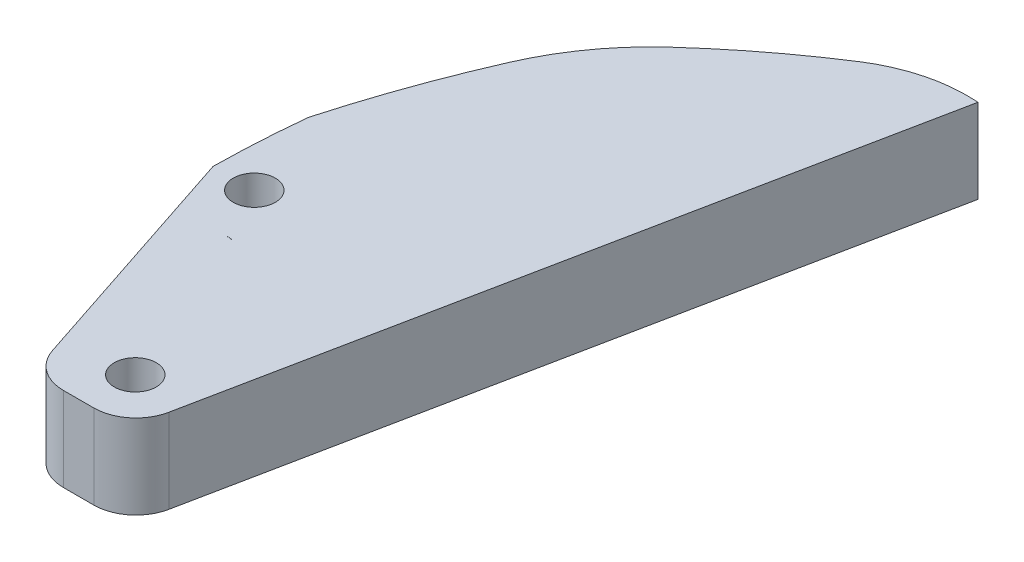
ISO-10303-21;
HEADER;
FILE_DESCRIPTION(('STEP AP214'),'2;1');
FILE_NAME('part.step','',(''),(''),'','','');
FILE_SCHEMA(('AUTOMOTIVE_DESIGN { 1 0 10303 214 1 1 1 1 }'));
ENDSEC;
DATA;
#1=APPLICATION_CONTEXT('core data for automotive mechanical design processes');
#2=APPLICATION_PROTOCOL_DEFINITION('international standard','automotive_design',2000,#1);
#3=PRODUCT_CONTEXT('',#1,'mechanical');
#4=PRODUCT('Part','Part','',(#3));
#5=PRODUCT_RELATED_PRODUCT_CATEGORY('part','',(#4));
#6=PRODUCT_DEFINITION_FORMATION('','',#4);
#7=PRODUCT_DEFINITION_CONTEXT('part definition',#1,'design');
#8=PRODUCT_DEFINITION('design','',#6,#7);
#9=PRODUCT_DEFINITION_SHAPE('','',#8);
#10=(LENGTH_UNIT() NAMED_UNIT(*) SI_UNIT(.MILLI.,.METRE.));
#11=(NAMED_UNIT(*) PLANE_ANGLE_UNIT() SI_UNIT($,.RADIAN.));
#12=(NAMED_UNIT(*) SI_UNIT($,.STERADIAN.) SOLID_ANGLE_UNIT());
#13=UNCERTAINTY_MEASURE_WITH_UNIT(LENGTH_MEASURE(1.E-05),#10,'distance_accuracy_value','');
#14=(GEOMETRIC_REPRESENTATION_CONTEXT(3) GLOBAL_UNCERTAINTY_ASSIGNED_CONTEXT((#13)) GLOBAL_UNIT_ASSIGNED_CONTEXT((#10,
#11,#12)) REPRESENTATION_CONTEXT('',''));
#15=CARTESIAN_POINT('',(0.,0.,0.));
#16=DIRECTION('',(0.,0.,1.));
#17=DIRECTION('',(1.,0.,0.));
#18=AXIS2_PLACEMENT_3D('',#15,#16,#17);
#19=CARTESIAN_POINT('',(9.61266494774314,4.,-27.3528767027445));
#20=DIRECTION('',(0.,1.,0.));
#21=DIRECTION('',(0.,0.,1.));
#22=AXIS2_PLACEMENT_3D('',#19,#20,#21);
#23=CYLINDRICAL_SURFACE('',#22,7.);
#24=DIRECTION('',(0.,-1.,0.));
#25=VECTOR('',#24,1.);
#26=CARTESIAN_POINT('',(7.32942538303462,4.,-33.9700375055473));
#27=LINE('',#26,#25);
#28=CARTESIAN_POINT('',(7.32942538303469,0.,-33.9700375055473));
#29=VERTEX_POINT('',#28);
#30=CARTESIAN_POINT('',(7.32942538303469,4.,-33.9700375055473));
#31=VERTEX_POINT('',#30);
#32=EDGE_CURVE('E256',#29,#31,#27,.F.);
#33=ORIENTED_EDGE('',*,*,#32,.F.);
#34=CARTESIAN_POINT('',(9.61266494774314,0.,-27.3528767027445));
#35=DIRECTION('',(0.,1.,0.));
#36=DIRECTION('',(0.,0.,1.));
#37=AXIS2_PLACEMENT_3D('',#34,#35,#36);
#38=CIRCLE('',#37,7.);
#39=CARTESIAN_POINT('',(5.84513074595936,0.,-33.25251110145));
#40=VERTEX_POINT('',#39);
#41=EDGE_CURVE('E42',#40,#29,#38,.F.);
#42=ORIENTED_EDGE('',*,*,#41,.F.);
#43=DIRECTION('',(0.,-1.,0.));
#44=VECTOR('',#43,1.);
#45=CARTESIAN_POINT('',(5.84513074595937,4.,-33.25251110145));
#46=LINE('',#45,#44);
#47=CARTESIAN_POINT('',(5.84513074595936,4.,-33.25251110145));
#48=VERTEX_POINT('',#47);
#49=EDGE_CURVE('E259',#48,#40,#46,.T.);
#50=ORIENTED_EDGE('',*,*,#49,.F.);
#51=CARTESIAN_POINT('',(9.61266494774314,4.,-27.3528767027445));
#52=DIRECTION('',(0.,1.,0.));
#53=DIRECTION('',(0.,0.,1.));
#54=AXIS2_PLACEMENT_3D('',#51,#52,#53);
#55=CIRCLE('',#54,7.);
#56=EDGE_CURVE('E11',#31,#48,#55,.T.);
#57=ORIENTED_EDGE('',*,*,#56,.F.);
#58=EDGE_LOOP('',(#33,#42,#50,#57));
#59=FACE_BOUND('',#58,.T.);
#60=ADVANCED_FACE('F35',(#59),#23,.T.);
#61=CARTESIAN_POINT('',(9.70663606833445,4.,-27.3848139031822));
#62=DIRECTION('',(0.,1.,0.));
#63=DIRECTION('',(0.,0.,1.));
#64=AXIS2_PLACEMENT_3D('',#61,#62,#63);
#65=CYLINDRICAL_SURFACE('',#64,7.);
#66=DIRECTION('',(0.,-1.,0.));
#67=VECTOR('',#66,1.);
#68=CARTESIAN_POINT('',(9.49857825519762,4.,-34.3817212161593));
#69=LINE('',#68,#67);
#70=CARTESIAN_POINT('',(9.49857825519765,0.,-34.3817212161593));
#71=VERTEX_POINT('',#70);
#72=CARTESIAN_POINT('',(9.49857825519765,4.,-34.3817212161593));
#73=VERTEX_POINT('',#72);
#74=EDGE_CURVE('E246',#71,#73,#69,.F.);
#75=ORIENTED_EDGE('',*,*,#74,.F.);
#76=CARTESIAN_POINT('',(9.70663606833445,0.,-27.3848139031822));
#77=DIRECTION('',(0.,1.,0.));
#78=DIRECTION('',(0.,0.,1.));
#79=AXIS2_PLACEMENT_3D('',#76,#77,#78);
#80=CIRCLE('',#79,7.);
#81=CARTESIAN_POINT('',(7.48492721860419,0.,-34.0228866496222));
#82=VERTEX_POINT('',#81);
#83=EDGE_CURVE('E252',#82,#71,#80,.F.);
#84=ORIENTED_EDGE('',*,*,#83,.F.);
#85=DIRECTION('',(0.,-1.,0.));
#86=VECTOR('',#85,1.);
#87=CARTESIAN_POINT('',(7.4849272186042,4.,-34.0228866496223));
#88=LINE('',#87,#86);
#89=CARTESIAN_POINT('',(7.48492721860419,4.,-34.0228866496222));
#90=VERTEX_POINT('',#89);
#91=EDGE_CURVE('E249',#90,#82,#88,.T.);
#92=ORIENTED_EDGE('',*,*,#91,.F.);
#93=CARTESIAN_POINT('',(9.70663606833445,4.,-27.3848139031822));
#94=DIRECTION('',(0.,1.,0.));
#95=DIRECTION('',(0.,0.,1.));
#96=AXIS2_PLACEMENT_3D('',#93,#94,#95);
#97=CIRCLE('',#96,7.);
#98=EDGE_CURVE('E254',#73,#90,#97,.T.);
#99=ORIENTED_EDGE('',*,*,#98,.F.);
#100=EDGE_LOOP('',(#75,#84,#92,#99));
#101=FACE_BOUND('',#100,.T.);
#102=ADVANCED_FACE('F270',(#101),#65,.T.);
#103=CARTESIAN_POINT('',(9.41889752565897,4.,-19.6788428566589));
#104=DIRECTION('',(0.,1.,0.));
#105=DIRECTION('',(0.,0.,1.));
#106=AXIS2_PLACEMENT_3D('',#103,#104,#105);
#107=CYLINDRICAL_SURFACE('',#106,13.);
#108=DIRECTION('',(0.,-1.,0.));
#109=VECTOR('',#108,1.);
#110=CARTESIAN_POINT('',(0.680013637686255,4.,-29.3033900352294));
#111=LINE('',#110,#109);
#112=CARTESIAN_POINT('',(0.680013637686262,0.,-29.3033900352294));
#113=VERTEX_POINT('',#112);
#114=CARTESIAN_POINT('',(0.680013637686262,4.,-29.3033900352294));
#115=VERTEX_POINT('',#114);
#116=EDGE_CURVE('E234',#113,#115,#111,.F.);
#117=ORIENTED_EDGE('',*,*,#116,.F.);
#118=CARTESIAN_POINT('',(9.41889752565897,0.,-19.6788428566589));
#119=DIRECTION('',(0.,1.,0.));
#120=DIRECTION('',(0.,0.,1.));
#121=AXIS2_PLACEMENT_3D('',#118,#119,#120);
#122=CIRCLE('',#121,13.);
#123=CARTESIAN_POINT('',(-2.4861675872471,0.,-24.9008563244188));
#124=VERTEX_POINT('',#123);
#125=EDGE_CURVE('E241',#124,#113,#122,.F.);
#126=ORIENTED_EDGE('',*,*,#125,.F.);
#127=DIRECTION('',(0.,-1.,0.));
#128=VECTOR('',#127,1.);
#129=CARTESIAN_POINT('',(-2.4861675872471,4.,-24.9008563244188));
#130=LINE('',#129,#128);
#131=CARTESIAN_POINT('',(-2.4861675872471,4.,-24.9008563244188));
#132=VERTEX_POINT('',#131);
#133=EDGE_CURVE('E238',#132,#124,#130,.T.);
#134=ORIENTED_EDGE('',*,*,#133,.F.);
#135=CARTESIAN_POINT('',(9.41889752565897,4.,-19.6788428566589));
#136=DIRECTION('',(0.,1.,0.));
#137=DIRECTION('',(0.,0.,1.));
#138=AXIS2_PLACEMENT_3D('',#135,#136,#137);
#139=CIRCLE('',#138,13.);
#140=EDGE_CURVE('E244',#115,#132,#139,.T.);
#141=ORIENTED_EDGE('',*,*,#140,.F.);
#142=EDGE_LOOP('',(#117,#126,#134,#141));
#143=FACE_BOUND('',#142,.T.);
#144=ADVANCED_FACE('F314',(#143),#107,.T.);
#145=CARTESIAN_POINT('',(45.9804828344079,4.,-3.64154368406012));
#146=DIRECTION('',(0.,-1.,0.));
#147=DIRECTION('',(0.,0.,-1.));
#148=AXIS2_PLACEMENT_3D('',#145,#146,#147);
#149=CYLINDRICAL_SURFACE('',#148,52.9242343075025);
#150=CARTESIAN_POINT('',(45.9804828344079,4.,-3.64154368406012));
#151=DIRECTION('',(0.,1.,0.));
#152=DIRECTION('',(0.,0.,1.));
#153=AXIS2_PLACEMENT_3D('',#150,#151,#152);
#154=CIRCLE('',#153,52.9242343075025);
#155=CARTESIAN_POINT('',(-5.00389485258667,4.,-17.8390015165496));
#156=VERTEX_POINT('',#155);
#157=EDGE_CURVE('E158',#132,#156,#154,.T.);
#158=ORIENTED_EDGE('',*,*,#157,.F.);
#159=ORIENTED_EDGE('',*,*,#133,.T.);
#160=CARTESIAN_POINT('',(45.9804828344079,0.,-3.64154368406012));
#161=DIRECTION('',(0.,1.,0.));
#162=DIRECTION('',(0.,0.,1.));
#163=AXIS2_PLACEMENT_3D('',#160,#161,#162);
#164=CIRCLE('',#163,52.9242343075025);
#165=CARTESIAN_POINT('',(-5.00389485258667,0.,-17.8390015165496));
#166=VERTEX_POINT('',#165);
#167=EDGE_CURVE('E191',#124,#166,#164,.T.);
#168=ORIENTED_EDGE('',*,*,#167,.T.);
#169=DIRECTION('',(0.,-1.,0.));
#170=VECTOR('',#169,1.);
#171=CARTESIAN_POINT('',(-5.00389485258667,4.,-17.8390015165496));
#172=LINE('',#171,#170);
#173=EDGE_CURVE('E231',#156,#166,#172,.T.);
#174=ORIENTED_EDGE('',*,*,#173,.F.);
#175=EDGE_LOOP('',(#158,#159,#168,#174));
#176=FACE_BOUND('',#175,.T.);
#177=ADVANCED_FACE('F309',(#176),#149,.T.);
#178=CARTESIAN_POINT('',(40.4186006337047,4.,-13.033633897636));
#179=DIRECTION('',(0.,-1.,0.));
#180=DIRECTION('',(0.,0.,-1.));
#181=AXIS2_PLACEMENT_3D('',#178,#179,#180);
#182=CYLINDRICAL_SURFACE('',#181,45.6759745835274);
#183=CARTESIAN_POINT('',(40.4186006337047,0.,-13.033633897636));
#184=DIRECTION('',(0.,1.,0.));
#185=DIRECTION('',(0.,0.,1.));
#186=AXIS2_PLACEMENT_3D('',#183,#184,#185);
#187=CIRCLE('',#186,45.6759745835274);
#188=CARTESIAN_POINT('',(-5.25449104109535,0.,-13.5468112747228));
#189=VERTEX_POINT('',#188);
#190=EDGE_CURVE('E193',#166,#189,#187,.T.);
#191=ORIENTED_EDGE('',*,*,#190,.T.);
#192=DIRECTION('',(0.,-1.,0.));
#193=VECTOR('',#192,1.);
#194=CARTESIAN_POINT('',(-5.25449104109535,4.,-13.5468112747228));
#195=LINE('',#194,#193);
#196=CARTESIAN_POINT('',(-5.25449104109535,4.,-13.5468112747228));
#197=VERTEX_POINT('',#196);
#198=EDGE_CURVE('E228',#197,#189,#195,.T.);
#199=ORIENTED_EDGE('',*,*,#198,.F.);
#200=CARTESIAN_POINT('',(40.4186006337047,4.,-13.033633897636));
#201=DIRECTION('',(0.,1.,0.));
#202=DIRECTION('',(0.,0.,1.));
#203=AXIS2_PLACEMENT_3D('',#200,#201,#202);
#204=CIRCLE('',#203,45.6759745835274);
#205=EDGE_CURVE('E160',#156,#197,#204,.T.);
#206=ORIENTED_EDGE('',*,*,#205,.F.);
#207=ORIENTED_EDGE('',*,*,#173,.T.);
#208=EDGE_LOOP('',(#191,#199,#206,#207));
#209=FACE_BOUND('',#208,.T.);
#210=ADVANCED_FACE('F306',(#209),#182,.T.);
#211=CARTESIAN_POINT('',(-0.70407914033243,4.,0.2325114351914));
#212=DIRECTION('',(0.949562277043815,0.,-0.313578510130024));
#213=DIRECTION('',(-0.313578510130024,0.,-0.949562277043815));
#214=AXIS2_PLACEMENT_3D('',#211,#212,#213);
#215=PLANE('',#214);
#216=DIRECTION('',(0.313578510130024,0.,0.949562277043815));
#217=VECTOR('',#216,1.);
#218=CARTESIAN_POINT('',(-0.70407914033243,0.,0.2325114351914));
#219=LINE('',#218,#217);
#220=CARTESIAN_POINT('',(-1.48741211031749,0.,-2.13953707780806));
#221=VERTEX_POINT('',#220);
#222=EDGE_CURVE('E195',#189,#221,#219,.T.);
#223=ORIENTED_EDGE('',*,*,#222,.T.);
#224=DIRECTION('',(0.,-1.,0.));
#225=VECTOR('',#224,1.);
#226=CARTESIAN_POINT('',(-1.48741211031749,4.,-2.13953707780806));
#227=LINE('',#226,#225);
#228=CARTESIAN_POINT('',(-1.48741211031749,4.,-2.13953707780806));
#229=VERTEX_POINT('',#228);
#230=EDGE_CURVE('E225',#229,#221,#227,.T.);
#231=ORIENTED_EDGE('',*,*,#230,.F.);
#232=DIRECTION('',(0.313578510130024,0.,0.949562277043815));
#233=VECTOR('',#232,1.);
#234=CARTESIAN_POINT('',(-0.70407914033243,4.,0.2325114351914));
#235=LINE('',#234,#233);
#236=EDGE_CURVE('E165',#197,#229,#235,.T.);
#237=ORIENTED_EDGE('',*,*,#236,.F.);
#238=ORIENTED_EDGE('',*,*,#198,.T.);
#239=EDGE_LOOP('',(#223,#231,#237,#238));
#240=FACE_BOUND('',#239,.T.);
#241=ADVANCED_FACE('F299',(#240),#215,.F.);
#242=CARTESIAN_POINT('',(0.411712443770136,4.,-2.76669409806811));
#243=DIRECTION('',(0.,-1.,0.));
#244=DIRECTION('',(0.,0.,-1.));
#245=AXIS2_PLACEMENT_3D('',#242,#243,#244);
#246=CYLINDRICAL_SURFACE('',#245,2.);
#247=CARTESIAN_POINT('',(0.411712443770136,0.,-2.76669409806811));
#248=DIRECTION('',(0.,1.,0.));
#249=DIRECTION('',(0.,0.,1.));
#250=AXIS2_PLACEMENT_3D('',#247,#248,#249);
#251=CIRCLE('',#250,2.);
#252=CARTESIAN_POINT('',(0.411712443770136,0.,-0.766694098068109));
#253=VERTEX_POINT('',#252);
#254=EDGE_CURVE('E197',#221,#253,#251,.T.);
#255=ORIENTED_EDGE('',*,*,#254,.T.);
#256=DIRECTION('',(0.,-1.,0.));
#257=VECTOR('',#256,1.);
#258=CARTESIAN_POINT('',(0.411712443770136,4.,-0.766694098068109));
#259=LINE('',#258,#257);
#260=CARTESIAN_POINT('',(0.411712443770136,4.,-0.766694098068109));
#261=VERTEX_POINT('',#260);
#262=EDGE_CURVE('E222',#261,#253,#259,.T.);
#263=ORIENTED_EDGE('',*,*,#262,.F.);
#264=CARTESIAN_POINT('',(0.411712443770136,4.,-2.76669409806811));
#265=DIRECTION('',(0.,1.,0.));
#266=DIRECTION('',(0.,0.,1.));
#267=AXIS2_PLACEMENT_3D('',#264,#265,#266);
#268=CIRCLE('',#267,2.);
#269=EDGE_CURVE('E167',#229,#261,#268,.T.);
#270=ORIENTED_EDGE('',*,*,#269,.F.);
#271=ORIENTED_EDGE('',*,*,#230,.T.);
#272=EDGE_LOOP('',(#255,#263,#270,#271));
#273=FACE_BOUND('',#272,.T.);
#274=ADVANCED_FACE('F295',(#273),#246,.T.);
#275=CARTESIAN_POINT('',(0.,4.,-0.766694098068109));
#276=DIRECTION('',(0.,0.,-1.));
#277=DIRECTION('',(-1.,0.,0.));
#278=AXIS2_PLACEMENT_3D('',#275,#276,#277);
#279=PLANE('',#278);
#280=DIRECTION('',(1.,0.,0.));
#281=VECTOR('',#280,1.);
#282=CARTESIAN_POINT('',(0.,0.,-0.766694098068109));
#283=LINE('',#282,#281);
#284=CARTESIAN_POINT('',(1.85541988901511,0.,-0.766694098068109));
#285=VERTEX_POINT('',#284);
#286=EDGE_CURVE('E199',#253,#285,#283,.T.);
#287=ORIENTED_EDGE('',*,*,#286,.T.);
#288=DIRECTION('',(0.,-1.,0.));
#289=VECTOR('',#288,1.);
#290=CARTESIAN_POINT('',(1.85541988901511,4.,-0.766694098068109));
#291=LINE('',#290,#289);
#292=CARTESIAN_POINT('',(1.85541988901511,4.,-0.766694098068109));
#293=VERTEX_POINT('',#292);
#294=EDGE_CURVE('E219',#293,#285,#291,.T.);
#295=ORIENTED_EDGE('',*,*,#294,.F.);
#296=DIRECTION('',(1.,0.,0.));
#297=VECTOR('',#296,1.);
#298=CARTESIAN_POINT('',(0.,4.,-0.766694098068109));
#299=LINE('',#298,#297);
#300=EDGE_CURVE('E169',#261,#293,#299,.T.);
#301=ORIENTED_EDGE('',*,*,#300,.F.);
#302=ORIENTED_EDGE('',*,*,#262,.T.);
#303=EDGE_LOOP('',(#287,#295,#301,#302));
#304=FACE_BOUND('',#303,.T.);
#305=ADVANCED_FACE('F290',(#304),#279,.F.);
#306=CARTESIAN_POINT('',(1.85541988901511,4.,-2.76669409806811));
#307=DIRECTION('',(0.,-1.,0.));
#308=DIRECTION('',(0.,0.,-1.));
#309=AXIS2_PLACEMENT_3D('',#306,#307,#308);
#310=CYLINDRICAL_SURFACE('',#309,2.);
#311=CARTESIAN_POINT('',(1.85541988901511,0.,-2.76669409806811));
#312=DIRECTION('',(0.,1.,0.));
#313=DIRECTION('',(0.,0.,1.));
#314=AXIS2_PLACEMENT_3D('',#311,#312,#313);
#315=CIRCLE('',#314,2.);
#316=CARTESIAN_POINT('',(3.81574257888445,0.,-2.37029158598799));
#317=VERTEX_POINT('',#316);
#318=EDGE_CURVE('E201',#285,#317,#315,.T.);
#319=ORIENTED_EDGE('',*,*,#318,.T.);
#320=DIRECTION('',(0.,-1.,0.));
#321=VECTOR('',#320,1.);
#322=CARTESIAN_POINT('',(3.81574257888445,4.,-2.37029158598799));
#323=LINE('',#322,#321);
#324=CARTESIAN_POINT('',(3.81574257888445,4.,-2.37029158598799));
#325=VERTEX_POINT('',#324);
#326=EDGE_CURVE('E216',#325,#317,#323,.T.);
#327=ORIENTED_EDGE('',*,*,#326,.F.);
#328=CARTESIAN_POINT('',(1.85541988901511,4.,-2.76669409806811));
#329=DIRECTION('',(0.,1.,0.));
#330=DIRECTION('',(0.,0.,1.));
#331=AXIS2_PLACEMENT_3D('',#328,#329,#330);
#332=CIRCLE('',#331,2.);
#333=EDGE_CURVE('E171',#293,#325,#332,.T.);
#334=ORIENTED_EDGE('',*,*,#333,.F.);
#335=ORIENTED_EDGE('',*,*,#294,.T.);
#336=EDGE_LOOP('',(#319,#327,#334,#335));
#337=FACE_BOUND('',#336,.T.);
#338=ADVANCED_FACE('F284',(#337),#310,.T.);
#339=CARTESIAN_POINT('',(3.20537127439758,4.,0.648167381771888));
#340=DIRECTION('',(-0.980161344934671,0.,-0.198201256040057));
#341=DIRECTION('',(-0.198201256040057,0.,0.980161344934671));
#342=AXIS2_PLACEMENT_3D('',#339,#340,#341);
#343=PLANE('',#342);
#344=DIRECTION('',(0.198201256040057,0.,-0.980161344934671));
#345=VECTOR('',#344,1.);
#346=CARTESIAN_POINT('',(3.20537127439758,0.,0.648167381771888));
#347=LINE('',#346,#345);
#348=CARTESIAN_POINT('',(10.2869532093436,0.,-34.3722609056196));
#349=VERTEX_POINT('',#348);
#350=EDGE_CURVE('E203',#317,#349,#347,.T.);
#351=ORIENTED_EDGE('',*,*,#350,.T.);
#352=DIRECTION('',(0.,-1.,0.));
#353=VECTOR('',#352,1.);
#354=CARTESIAN_POINT('',(10.2869532093436,4.,-34.3722609056196));
#355=LINE('',#354,#353);
#356=CARTESIAN_POINT('',(10.2869532093436,4.,-34.3722609056196));
#357=VERTEX_POINT('',#356);
#358=EDGE_CURVE('E149',#357,#349,#355,.T.);
#359=ORIENTED_EDGE('',*,*,#358,.F.);
#360=DIRECTION('',(0.198201256040057,0.,-0.980161344934671));
#361=VECTOR('',#360,1.);
#362=CARTESIAN_POINT('',(3.20537127439758,4.,0.648167381771888));
#363=LINE('',#362,#361);
#364=EDGE_CURVE('E173',#325,#357,#363,.T.);
#365=ORIENTED_EDGE('',*,*,#364,.F.);
#366=ORIENTED_EDGE('',*,*,#326,.T.);
#367=EDGE_LOOP('',(#351,#359,#365,#366));
#368=FACE_BOUND('',#367,.T.);
#369=ADVANCED_FACE('F280',(#368),#343,.F.);
#370=CARTESIAN_POINT('',(9.77946952300835,4.,-24.9354517573727));
#371=DIRECTION('',(0.,-1.,0.));
#372=DIRECTION('',(0.,0.,-1.));
#373=AXIS2_PLACEMENT_3D('',#370,#371,#372);
#374=CYLINDRICAL_SURFACE('',#373,9.45044478277806);
#375=CARTESIAN_POINT('',(9.77946952300835,0.,-24.9354517573727));
#376=DIRECTION('',(0.,1.,0.));
#377=DIRECTION('',(0.,0.,1.));
#378=AXIS2_PLACEMENT_3D('',#375,#376,#377);
#379=CIRCLE('',#378,9.45044478277806);
#380=EDGE_CURVE('E205',#349,#71,#379,.T.);
#381=ORIENTED_EDGE('',*,*,#380,.T.);
#382=ORIENTED_EDGE('',*,*,#74,.T.);
#383=CARTESIAN_POINT('',(9.77946952300835,4.,-24.9354517573727));
#384=DIRECTION('',(0.,1.,0.));
#385=DIRECTION('',(0.,0.,1.));
#386=AXIS2_PLACEMENT_3D('',#383,#384,#385);
#387=CIRCLE('',#386,9.45044478277806);
#388=EDGE_CURVE('E175',#357,#73,#387,.T.);
#389=ORIENTED_EDGE('',*,*,#388,.F.);
#390=ORIENTED_EDGE('',*,*,#358,.T.);
#391=EDGE_LOOP('',(#381,#382,#389,#390));
#392=FACE_BOUND('',#391,.T.);
#393=ADVANCED_FACE('F275',(#392),#374,.T.);
#394=CARTESIAN_POINT('',(13.0996808315966,4.,-17.2469968020817));
#395=DIRECTION('',(0.,-1.,0.));
#396=DIRECTION('',(0.,0.,-1.));
#397=AXIS2_PLACEMENT_3D('',#394,#395,#396);
#398=CYLINDRICAL_SURFACE('',#397,17.6905607121828);
#399=CARTESIAN_POINT('',(13.0996808315966,0.,-17.2469968020817));
#400=DIRECTION('',(0.,1.,0.));
#401=DIRECTION('',(0.,0.,1.));
#402=AXIS2_PLACEMENT_3D('',#399,#400,#401);
#403=CIRCLE('',#402,17.6905607121828);
#404=EDGE_CURVE('E208',#82,#29,#403,.T.);
#405=ORIENTED_EDGE('',*,*,#404,.T.);
#406=ORIENTED_EDGE('',*,*,#32,.T.);
#407=CARTESIAN_POINT('',(13.0996808315966,4.,-17.2469968020817));
#408=DIRECTION('',(0.,1.,0.));
#409=DIRECTION('',(0.,0.,1.));
#410=AXIS2_PLACEMENT_3D('',#407,#408,#409);
#411=CIRCLE('',#410,17.6905607121828);
#412=EDGE_CURVE('E178',#90,#31,#411,.T.);
#413=ORIENTED_EDGE('',*,*,#412,.F.);
#414=ORIENTED_EDGE('',*,*,#91,.T.);
#415=EDGE_LOOP('',(#405,#406,#413,#414));
#416=FACE_BOUND('',#415,.T.);
#417=ADVANCED_FACE('F266',(#416),#398,.T.);
#418=CARTESIAN_POINT('',(-1.,4.,-19.));
#419=DIRECTION('',(0.,-1.,0.));
#420=DIRECTION('',(0.,0.,-1.));
#421=AXIS2_PLACEMENT_3D('',#418,#419,#420);
#422=CYLINDRICAL_SURFACE('',#421,8.0649838357434);
#423=CARTESIAN_POINT('',(-1.,0.,-19.));
#424=DIRECTION('',(0.,1.,0.));
#425=DIRECTION('',(0.,0.,1.));
#426=AXIS2_PLACEMENT_3D('',#423,#424,#425);
#427=CIRCLE('',#426,8.0649838357434);
#428=CARTESIAN_POINT('',(-2.02015410413974,0.,-10.9997968854154));
#429=VERTEX_POINT('',#428);
#430=CARTESIAN_POINT('',(-1.76086985038225,0.,-10.9709875238868));
#431=VERTEX_POINT('',#430);
#432=EDGE_CURVE('E144',#429,#431,#427,.T.);
#433=ORIENTED_EDGE('',*,*,#432,.F.);
#434=DIRECTION('',(0.,-1.,0.));
#435=VECTOR('',#434,1.);
#436=CARTESIAN_POINT('',(-2.02015410413974,4.,-10.9997968854154));
#437=LINE('',#436,#435);
#438=CARTESIAN_POINT('',(-2.02015410413974,4.,-10.9997968854154));
#439=VERTEX_POINT('',#438);
#440=EDGE_CURVE('E138',#439,#429,#437,.T.);
#441=ORIENTED_EDGE('',*,*,#440,.F.);
#442=CARTESIAN_POINT('',(-1.,4.,-19.));
#443=DIRECTION('',(0.,1.,0.));
#444=DIRECTION('',(0.,0.,1.));
#445=AXIS2_PLACEMENT_3D('',#442,#443,#444);
#446=CIRCLE('',#445,8.0649838357434);
#447=CARTESIAN_POINT('',(-1.76086985038225,4.,-10.9709875238868));
#448=VERTEX_POINT('',#447);
#449=EDGE_CURVE('E141',#439,#448,#446,.T.);
#450=ORIENTED_EDGE('',*,*,#449,.T.);
#451=DIRECTION('',(0.,-1.,0.));
#452=VECTOR('',#451,1.);
#453=CARTESIAN_POINT('',(-1.76086985038225,4.,-10.9709875238868));
#454=LINE('',#453,#452);
#455=EDGE_CURVE('E150',#448,#431,#454,.T.);
#456=ORIENTED_EDGE('',*,*,#455,.T.);
#457=EDGE_LOOP('',(#433,#441,#450,#456));
#458=FACE_BOUND('',#457,.T.);
#459=ADVANCED_FACE('F140',(#458),#422,.F.);
#460=CARTESIAN_POINT('',(-2.,4.,-10.));
#461=DIRECTION('',(0.,-1.,0.));
#462=DIRECTION('',(0.,0.,-1.));
#463=AXIS2_PLACEMENT_3D('',#460,#461,#462);
#464=CYLINDRICAL_SURFACE('',#463,1.);
#465=CARTESIAN_POINT('',(-2.,0.,-10.));
#466=DIRECTION('',(0.,1.,0.));
#467=DIRECTION('',(0.,0.,1.));
#468=AXIS2_PLACEMENT_3D('',#465,#466,#467);
#469=CIRCLE('',#468,1.);
#470=EDGE_CURVE('E189',#431,#429,#469,.T.);
#471=ORIENTED_EDGE('',*,*,#470,.F.);
#472=ORIENTED_EDGE('',*,*,#455,.F.);
#473=CARTESIAN_POINT('',(-2.,4.,-10.));
#474=DIRECTION('',(0.,1.,0.));
#475=DIRECTION('',(0.,0.,1.));
#476=AXIS2_PLACEMENT_3D('',#473,#474,#475);
#477=CIRCLE('',#476,1.);
#478=EDGE_CURVE('E154',#448,#439,#477,.T.);
#479=ORIENTED_EDGE('',*,*,#478,.T.);
#480=ORIENTED_EDGE('',*,*,#440,.T.);
#481=EDGE_LOOP('',(#471,#472,#479,#480));
#482=FACE_BOUND('',#481,.T.);
#483=ADVANCED_FACE('F157',(#482),#464,.F.);
#484=CARTESIAN_POINT('',(-3.29417100933371,4.,-13.5468112747219));
#485=DIRECTION('',(0.,-1.,0.));
#486=DIRECTION('',(0.,0.,-1.));
#487=AXIS2_PLACEMENT_3D('',#484,#485,#486);
#488=CYLINDRICAL_SURFACE('',#487,1.);
#489=CARTESIAN_POINT('',(-3.29417100933371,4.,-13.5468112747219));
#490=DIRECTION('',(0.,1.,0.));
#491=DIRECTION('',(0.,0.,1.));
#492=AXIS2_PLACEMENT_3D('',#489,#490,#491);
#493=CIRCLE('',#492,1.);
#494=CARTESIAN_POINT('',(-3.29417100933371,4.,-12.5468112747219));
#495=VERTEX_POINT('',#494);
#496=EDGE_CURVE('E155',#495,#495,#493,.T.);
#497=ORIENTED_EDGE('',*,*,#496,.T.);
#498=EDGE_LOOP('',(#497));
#499=FACE_BOUND('',#498,.T.);
#500=CARTESIAN_POINT('',(-3.29417100933371,0.,-13.5468112747219));
#501=DIRECTION('',(0.,1.,0.));
#502=DIRECTION('',(0.,0.,1.));
#503=AXIS2_PLACEMENT_3D('',#500,#501,#502);
#504=CIRCLE('',#503,1.);
#505=CARTESIAN_POINT('',(-3.29417100933371,0.,-12.5468112747219));
#506=VERTEX_POINT('',#505);
#507=EDGE_CURVE('E185',#506,#506,#504,.T.);
#508=ORIENTED_EDGE('',*,*,#507,.F.);
#509=EDGE_LOOP('',(#508));
#510=FACE_BOUND('',#509,.T.);
#511=ADVANCED_FACE('F343',(#499,#510),#488,.F.);
#512=CARTESIAN_POINT('',(1.47865848620521,4.,-3.11569660996238));
#513=DIRECTION('',(0.,-1.,0.));
#514=DIRECTION('',(0.,0.,-1.));
#515=AXIS2_PLACEMENT_3D('',#512,#513,#514);
#516=CYLINDRICAL_SURFACE('',#515,1.);
#517=CARTESIAN_POINT('',(1.47865848620521,4.,-3.11569660996238));
#518=DIRECTION('',(0.,1.,0.));
#519=DIRECTION('',(0.,0.,1.));
#520=AXIS2_PLACEMENT_3D('',#517,#518,#519);
#521=CIRCLE('',#520,1.);
#522=CARTESIAN_POINT('',(1.47865848620521,4.,-2.11569660996238));
#523=VERTEX_POINT('',#522);
#524=EDGE_CURVE('E213',#523,#523,#521,.T.);
#525=ORIENTED_EDGE('',*,*,#524,.T.);
#526=EDGE_LOOP('',(#525));
#527=FACE_BOUND('',#526,.T.);
#528=CARTESIAN_POINT('',(1.47865848620521,0.,-3.11569660996238));
#529=DIRECTION('',(0.,1.,0.));
#530=DIRECTION('',(0.,0.,1.));
#531=AXIS2_PLACEMENT_3D('',#528,#529,#530);
#532=CIRCLE('',#531,1.);
#533=CARTESIAN_POINT('',(1.47865848620521,0.,-2.11569660996238));
#534=VERTEX_POINT('',#533);
#535=EDGE_CURVE('E182',#534,#534,#532,.T.);
#536=ORIENTED_EDGE('',*,*,#535,.F.);
#537=EDGE_LOOP('',(#536));
#538=FACE_BOUND('',#537,.T.);
#539=ADVANCED_FACE('F327',(#527,#538),#516,.F.);
#540=CARTESIAN_POINT('',(26.5907258724979,4.,-0.766694098860585));
#541=DIRECTION('',(0.,-1.,0.));
#542=DIRECTION('',(0.,0.,-1.));
#543=AXIS2_PLACEMENT_3D('',#540,#541,#542);
#544=CYLINDRICAL_SURFACE('',#543,38.544883233446);
#545=CARTESIAN_POINT('',(26.5907258724979,4.,-0.766694098860585));
#546=DIRECTION('',(0.,1.,0.));
#547=DIRECTION('',(0.,0.,1.));
#548=AXIS2_PLACEMENT_3D('',#545,#546,#547);
#549=CIRCLE('',#548,38.544883233446);
#550=EDGE_CURVE('E180',#48,#115,#549,.T.);
#551=ORIENTED_EDGE('',*,*,#550,.F.);
#552=ORIENTED_EDGE('',*,*,#49,.T.);
#553=CARTESIAN_POINT('',(26.5907258724979,0.,-0.766694098860585));
#554=DIRECTION('',(0.,1.,0.));
#555=DIRECTION('',(0.,0.,1.));
#556=AXIS2_PLACEMENT_3D('',#553,#554,#555);
#557=CIRCLE('',#556,38.544883233446);
#558=EDGE_CURVE('E211',#40,#113,#557,.T.);
#559=ORIENTED_EDGE('',*,*,#558,.T.);
#560=ORIENTED_EDGE('',*,*,#116,.T.);
#561=EDGE_LOOP('',(#551,#552,#559,#560));
#562=FACE_BOUND('',#561,.T.);
#563=ADVANCED_FACE('F317',(#562),#544,.T.);
#564=CARTESIAN_POINT('',(0.,4.,0.));
#565=DIRECTION('',(0.,1.,0.));
#566=DIRECTION('',(0.,0.,1.));
#567=AXIS2_PLACEMENT_3D('',#564,#565,#566);
#568=PLANE('',#567);
#569=ORIENTED_EDGE('',*,*,#524,.F.);
#570=EDGE_LOOP('',(#569));
#571=FACE_BOUND('',#570,.T.);
#572=ORIENTED_EDGE('',*,*,#496,.F.);
#573=EDGE_LOOP('',(#572));
#574=FACE_BOUND('',#573,.T.);
#575=ORIENTED_EDGE('',*,*,#449,.F.);
#576=ORIENTED_EDGE('',*,*,#478,.F.);
#577=EDGE_LOOP('',(#575,#576));
#578=FACE_BOUND('',#577,.T.);
#579=ORIENTED_EDGE('',*,*,#412,.T.);
#580=ORIENTED_EDGE('',*,*,#56,.T.);
#581=ORIENTED_EDGE('',*,*,#550,.T.);
#582=ORIENTED_EDGE('',*,*,#140,.T.);
#583=ORIENTED_EDGE('',*,*,#157,.T.);
#584=ORIENTED_EDGE('',*,*,#205,.T.);
#585=ORIENTED_EDGE('',*,*,#236,.T.);
#586=ORIENTED_EDGE('',*,*,#269,.T.);
#587=ORIENTED_EDGE('',*,*,#300,.T.);
#588=ORIENTED_EDGE('',*,*,#333,.T.);
#589=ORIENTED_EDGE('',*,*,#364,.T.);
#590=ORIENTED_EDGE('',*,*,#388,.T.);
#591=ORIENTED_EDGE('',*,*,#98,.T.);
#592=EDGE_LOOP('',(#579,#580,#581,#582,#583,#584,#585,#586,#587,#588,#589,#590,#591));
#593=FACE_BOUND('',#592,.T.);
#594=ADVANCED_FACE('F153',(#571,#574,#578,#593),#568,.T.);
#595=CARTESIAN_POINT('',(0.,0.,0.));
#596=DIRECTION('',(0.,1.,0.));
#597=DIRECTION('',(0.,0.,1.));
#598=AXIS2_PLACEMENT_3D('',#595,#596,#597);
#599=PLANE('',#598);
#600=ORIENTED_EDGE('',*,*,#535,.T.);
#601=EDGE_LOOP('',(#600));
#602=FACE_BOUND('',#601,.T.);
#603=ORIENTED_EDGE('',*,*,#507,.T.);
#604=EDGE_LOOP('',(#603));
#605=FACE_BOUND('',#604,.T.);
#606=ORIENTED_EDGE('',*,*,#432,.T.);
#607=ORIENTED_EDGE('',*,*,#470,.T.);
#608=EDGE_LOOP('',(#606,#607));
#609=FACE_BOUND('',#608,.T.);
#610=ORIENTED_EDGE('',*,*,#558,.F.);
#611=ORIENTED_EDGE('',*,*,#41,.T.);
#612=ORIENTED_EDGE('',*,*,#404,.F.);
#613=ORIENTED_EDGE('',*,*,#83,.T.);
#614=ORIENTED_EDGE('',*,*,#380,.F.);
#615=ORIENTED_EDGE('',*,*,#350,.F.);
#616=ORIENTED_EDGE('',*,*,#318,.F.);
#617=ORIENTED_EDGE('',*,*,#286,.F.);
#618=ORIENTED_EDGE('',*,*,#254,.F.);
#619=ORIENTED_EDGE('',*,*,#222,.F.);
#620=ORIENTED_EDGE('',*,*,#190,.F.);
#621=ORIENTED_EDGE('',*,*,#167,.F.);
#622=ORIENTED_EDGE('',*,*,#125,.T.);
#623=EDGE_LOOP('',(#610,#611,#612,#613,#614,#615,#616,#617,#618,#619,#620,#621,#622));
#624=FACE_BOUND('',#623,.T.);
#625=ADVANCED_FACE('F263',(#602,#605,#609,#624),#599,.F.);
#626=CLOSED_SHELL('',(#60,#102,#144,#177,#210,#241,#274,#305,#338,#369,#393,#417,#459,#483,#511,
#539,#563,#594,#625));
#627=MANIFOLD_SOLID_BREP('B2',#626);
#628=ADVANCED_BREP_SHAPE_REPRESENTATION('',(#18,#627),#14);
#629=SHAPE_DEFINITION_REPRESENTATION(#9,#628);
ENDSEC;
END-ISO-10303-21;
